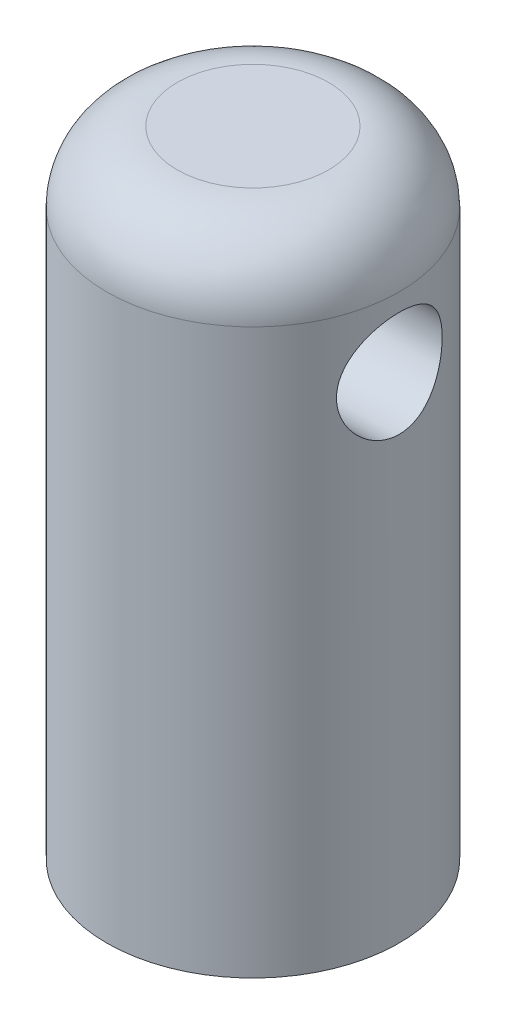
ISO-10303-21;
HEADER;
FILE_DESCRIPTION(('STEP AP214'),'2;1');
FILE_NAME('part.step','',(''),(''),'','','');
FILE_SCHEMA(('AUTOMOTIVE_DESIGN { 1 0 10303 214 1 1 1 1 }'));
ENDSEC;
DATA;
#1=APPLICATION_CONTEXT('core data for automotive mechanical design processes');
#2=APPLICATION_PROTOCOL_DEFINITION('international standard','automotive_design',2000,#1);
#3=PRODUCT_CONTEXT('',#1,'mechanical');
#4=PRODUCT('Part','Part','',(#3));
#5=PRODUCT_RELATED_PRODUCT_CATEGORY('part','',(#4));
#6=PRODUCT_DEFINITION_FORMATION('','',#4);
#7=PRODUCT_DEFINITION_CONTEXT('part definition',#1,'design');
#8=PRODUCT_DEFINITION('design','',#6,#7);
#9=PRODUCT_DEFINITION_SHAPE('','',#8);
#10=(LENGTH_UNIT() NAMED_UNIT(*) SI_UNIT(.MILLI.,.METRE.));
#11=(NAMED_UNIT(*) PLANE_ANGLE_UNIT() SI_UNIT($,.RADIAN.));
#12=(NAMED_UNIT(*) SI_UNIT($,.STERADIAN.) SOLID_ANGLE_UNIT());
#13=UNCERTAINTY_MEASURE_WITH_UNIT(LENGTH_MEASURE(1.E-05),#10,'distance_accuracy_value','');
#14=(GEOMETRIC_REPRESENTATION_CONTEXT(3) GLOBAL_UNCERTAINTY_ASSIGNED_CONTEXT((#13)) GLOBAL_UNIT_ASSIGNED_CONTEXT((#10,
#11,#12)) REPRESENTATION_CONTEXT('',''));
#15=CARTESIAN_POINT('',(0.,0.,0.));
#16=DIRECTION('',(0.,0.,1.));
#17=DIRECTION('',(1.,0.,0.));
#18=AXIS2_PLACEMENT_3D('',#15,#16,#17);
#19=CARTESIAN_POINT('',(0.,18.,0.));
#20=DIRECTION('',(0.,-1.,0.));
#21=DIRECTION('',(0.,0.,-1.));
#22=AXIS2_PLACEMENT_3D('',#19,#20,#21);
#23=CYLINDRICAL_SURFACE('',#22,4.15);
#24=CARTESIAN_POINT('',(0.,16.,0.));
#25=DIRECTION('',(0.,1.,0.));
#26=DIRECTION('',(0.,0.,1.));
#27=AXIS2_PLACEMENT_3D('',#24,#25,#26);
#28=CIRCLE('',#27,4.15);
#29=CARTESIAN_POINT('',(0.,16.,4.15));
#30=VERTEX_POINT('',#29);
#31=EDGE_CURVE('E10',#30,#30,#28,.F.);
#32=ORIENTED_EDGE('',*,*,#31,.T.);
#33=EDGE_LOOP('',(#32));
#34=FACE_BOUND('',#33,.T.);
#35=CARTESIAN_POINT('',(-4.15,12.5,0.));
#36=CARTESIAN_POINT('',(-4.15000143003029,12.4999980333435,-0.0814400855319912));
#37=CARTESIAN_POINT('',(-4.14758142156251,12.5066535382665,-0.162866271252026));
#38=CARTESIAN_POINT('',(-4.13816813003433,12.5330009360362,-0.323296632147034));
#39=CARTESIAN_POINT('',(-4.13117513878816,12.5526919970503,-0.402300961530375));
#40=CARTESIAN_POINT('',(-4.11336965741352,12.6043308814919,-0.555551373556141));
#41=CARTESIAN_POINT('',(-4.1025642129004,12.6362561048502,-0.629805936996274));
#42=CARTESIAN_POINT('',(-4.07821890340622,12.7113464147926,-0.771902880179988));
#43=CARTESIAN_POINT('',(-4.06467836386934,12.7545142749068,-0.83974367202545));
#44=CARTESIAN_POINT('',(-4.03566630697274,12.8526659904825,-0.96979273515427));
#45=CARTESIAN_POINT('',(-4.02014287032182,12.9080188449633,-1.03171083460301));
#46=CARTESIAN_POINT('',(-3.98917992273541,13.0281857192339,-1.14561514020706));
#47=CARTESIAN_POINT('',(-3.97374043604327,13.0930023356186,-1.19759861150761));
#48=CARTESIAN_POINT('',(-3.94410071947246,13.23301636052,-1.29193844006037));
#49=CARTESIAN_POINT('',(-3.92996245591669,13.3084968857948,-1.33389600496389));
#50=CARTESIAN_POINT('',(-3.90532763129971,13.4660355486232,-1.40439347036955));
#51=CARTESIAN_POINT('',(-3.89482973324999,13.5480912576648,-1.43293829830652));
#52=CARTESIAN_POINT('',(-3.87921646915367,13.7131223491049,-1.47467343668188));
#53=CARTESIAN_POINT('',(-3.87390880128095,13.7959396905442,-1.48841441150724));
#54=CARTESIAN_POINT('',(-3.86871199521892,13.962861622455,-1.50187373475926));
#55=CARTESIAN_POINT('',(-3.86882081838796,14.046965716708,-1.50159735899095));
#56=CARTESIAN_POINT('',(-3.87427796865347,14.2091558282624,-1.48745303888326));
#57=CARTESIAN_POINT('',(-3.87933796727285,14.2873185316011,-1.47433301698891));
#58=CARTESIAN_POINT('',(-3.89365064359877,14.4402472250398,-1.43610476286552));
#59=CARTESIAN_POINT('',(-3.902903907682,14.5150127384752,-1.41099485397165));
#60=CARTESIAN_POINT('',(-3.92474456516685,14.6606073478115,-1.34906302546195));
#61=CARTESIAN_POINT('',(-3.93738909491279,14.7313410988246,-1.31203799280697));
#62=CARTESIAN_POINT('',(-3.96456687961516,14.8658151955463,-1.22746821395406));
#63=CARTESIAN_POINT('',(-3.9791007522295,14.9295532416186,-1.17992002397261));
#64=CARTESIAN_POINT('',(-4.00952118448171,15.05238869163,-1.07217458625208));
#65=CARTESIAN_POINT('',(-4.02543570504372,15.1109523235679,-1.01137531117106));
#66=CARTESIAN_POINT('',(-4.05604403844514,15.2172046397643,-0.880630279258244));
#67=CARTESIAN_POINT('',(-4.07073768921005,15.2648918816078,-0.810683311202381));
#68=CARTESIAN_POINT('',(-4.09750501515251,15.3485711993468,-0.662344833747496));
#69=CARTESIAN_POINT('',(-4.10954078200126,15.3843972988541,-0.583852373734485));
#70=CARTESIAN_POINT('',(-4.12935735570145,15.4421628926842,-0.421412511592169));
#71=CARTESIAN_POINT('',(-4.13713991256227,15.4641080989717,-0.337467368933897));
#72=CARTESIAN_POINT('',(-4.14727149897669,15.4924901151261,-0.171006353890036));
#73=CARTESIAN_POINT('',(-4.14987240556979,15.4996465010243,-0.0886283682666874));
#74=CARTESIAN_POINT('',(-4.15011826285779,15.5003276814301,0.0761822484580407));
#75=CARTESIAN_POINT('',(-4.14776422104452,15.4938552470915,0.158614865044288));
#76=CARTESIAN_POINT('',(-4.13853111751534,15.4680176316146,0.318162968952119));
#77=CARTESIAN_POINT('',(-4.13181406990674,15.4491137730244,0.395363500790042));
#78=CARTESIAN_POINT('',(-4.11469233681061,15.3995469499806,0.545451085567498));
#79=CARTESIAN_POINT('',(-4.10428717191908,15.3688824567653,0.6183375763036));
#80=CARTESIAN_POINT('',(-4.08045745892182,15.2957085926606,0.760052659190625));
#81=CARTESIAN_POINT('',(-4.06695527801488,15.2528864169269,0.828706290933764));
#82=CARTESIAN_POINT('',(-4.03843865829634,15.1569706038692,0.958075492738519));
#83=CARTESIAN_POINT('',(-4.02342369172645,15.1038733759478,1.01878827541994));
#84=CARTESIAN_POINT('',(-3.99253971688616,14.9855470646003,1.13396362340661));
#85=CARTESIAN_POINT('',(-3.97666822387657,14.9198189506232,1.18791415077587));
#86=CARTESIAN_POINT('',(-3.94665847791854,14.779918094427,1.28410809378483));
#87=CARTESIAN_POINT('',(-3.93252032519495,14.705744864374,1.32635083263708));
#88=CARTESIAN_POINT('',(-3.90766943749284,14.5506688773045,1.39787832776533));
#89=CARTESIAN_POINT('',(-3.89696272656018,14.469754596343,1.42714032999966));
#90=CARTESIAN_POINT('',(-3.88045113695488,14.3036576009353,1.47145132511309));
#91=CARTESIAN_POINT('',(-3.87464351502234,14.2184773036053,1.48650827271605));
#92=CARTESIAN_POINT('',(-3.86893495059697,14.0517694834162,1.50129913045682));
#93=CARTESIAN_POINT('',(-3.86870052741929,13.970329427219,1.50189818503133));
#94=CARTESIAN_POINT('',(-3.87332008254716,13.8085752873644,1.48994353454471));
#95=CARTESIAN_POINT('',(-3.87817364559763,13.7282611123604,1.47739090285615));
#96=CARTESIAN_POINT('',(-3.89215405778937,13.5731716662505,1.44014369068852));
#97=CARTESIAN_POINT('',(-3.90116507702552,13.4983062497496,1.41577736718979));
#98=CARTESIAN_POINT('',(-3.9223854643484,13.3536767318407,1.35587501491621));
#99=CARTESIAN_POINT('',(-3.93459561175959,13.2839138787484,1.32033626405706));
#100=CARTESIAN_POINT('',(-3.96159301798298,13.1477092834115,1.23704697958592));
#101=CARTESIAN_POINT('',(-3.9764781069732,13.0816042289039,1.18877789035097));
#102=CARTESIAN_POINT('',(-4.00678846315337,12.9581546803121,1.0822251629785));
#103=CARTESIAN_POINT('',(-4.02221389453071,12.9008128778996,1.02393845951909));
#104=CARTESIAN_POINT('',(-4.05277121962981,12.7936739448662,0.895599109546909));
#105=CARTESIAN_POINT('',(-4.06785203653187,12.7443816776965,0.825111032389388));
#106=CARTESIAN_POINT('',(-4.09521579412732,12.6583743200156,0.676329473531957));
#107=CARTESIAN_POINT('',(-4.10749884732183,12.6216587237529,0.59803630586528));
#108=CARTESIAN_POINT('',(-4.12800060422919,12.5617029437689,0.434702638880409));
#109=CARTESIAN_POINT('',(-4.13616252567104,12.5386502998642,0.349585662601991));
#110=CARTESIAN_POINT('',(-4.14716034530471,12.5078030561034,0.176306177660809));
#111=CARTESIAN_POINT('',(-4.14999845223708,12.5000021285689,0.0881449474633849));
#112=CARTESIAN_POINT('',(-4.15,12.5,0.));
#113=B_SPLINE_CURVE_WITH_KNOTS('',3,(#35,#36,#37,#38,#39,#40,#41,#42,#43,#44,#45,#46,#47,#48,
#49,#50,#51,#52,#53,#54,#55,#56,#57,#58,#59,#60,#61,#62,#63,#64,#65,#66,#67,#68,#69,#70,#71,#72,
#73,#74,#75,#76,#77,#78,#79,#80,#81,#82,#83,#84,#85,#86,#87,#88,#89,#90,#91,#92,#93,#94,#95,#96,
#97,#98,#99,#100,#101,#102,#103,#104,#105,#106,#107,#108,#109,#110,#111,#112),.UNSPECIFIED.,.T.,
.F.,(4,2,2,2,2,2,2,2,2,2,2,2,2,2,2,2,2,2,2,2,2,2,2,2,2,2,2,2,2,2,2,2,2,2,2,2,2,2,4),(0.,
0.243995375605332,0.487975182733872,0.731506443788315,0.975097840393538,1.22744646617127,
1.4798644600067,1.7410821226397,2.00220374661341,2.2532359353852,2.50417364217614,
2.7413180622714,2.97849565433975,3.21995193400208,3.46148734922635,3.71801803717578,
3.97458272619208,4.23459919210401,4.49450859194187,4.74144166583083,4.98832453555947,
5.22652677827391,5.46475999533177,5.70978599880215,5.95489778127164,6.21319747375317,
6.47151209454885,6.73027774501933,6.98889840250596,7.23200244813754,7.47508665442021,
7.71177316638803,7.94851739013103,8.19701182001203,8.44558242331981,8.70628568188906,
8.96697845544593,9.23117130220569,9.4952545165534),.UNSPECIFIED.);
#114=CARTESIAN_POINT('',(-4.15,12.5,0.));
#115=VERTEX_POINT('',#114);
#116=EDGE_CURVE('E46',#115,#115,#113,.T.);
#117=ORIENTED_EDGE('',*,*,#116,.T.);
#118=EDGE_LOOP('',(#117));
#119=FACE_BOUND('',#118,.T.);
#120=CARTESIAN_POINT('',(3.86943148278917,14.,-1.5));
#121=CARTESIAN_POINT('',(3.86942965987514,13.918756639483,-1.50000204617039));
#122=CARTESIAN_POINT('',(3.8720180417576,13.8375272963331,-1.49337742480288));
#123=CARTESIAN_POINT('',(3.88202574833964,13.6775035304927,-1.46716389412437));
#124=CARTESIAN_POINT('',(3.88944521590768,13.5987091798837,-1.44757460141219));
#125=CARTESIAN_POINT('',(3.90816721246071,13.4459063125508,-1.3962327859776));
#126=CARTESIAN_POINT('',(3.91946101705452,13.3718874832494,-1.36450757310196));
#127=CARTESIAN_POINT('',(3.94464557685853,13.2301953075299,-1.28989018879869));
#128=CARTESIAN_POINT('',(3.95853704885431,13.1625237202914,-1.24699493388767));
#129=CARTESIAN_POINT('',(3.98806965416322,13.0323266106155,-1.14913649213948));
#130=CARTESIAN_POINT('',(4.00375971531451,12.9701356062644,-1.09374289340616));
#131=CARTESIAN_POINT('',(4.034711704888,12.855692649012,-0.97337520313558));
#132=CARTESIAN_POINT('',(4.04997354958261,12.8034426284474,-0.908399253321233));
#133=CARTESIAN_POINT('',(4.07892597308986,12.7087853435518,-0.768203530001209));
#134=CARTESIAN_POINT('',(4.09255243408543,12.6667372701131,-0.692726816994579));
#135=CARTESIAN_POINT('',(4.11611459871196,12.596071751933,-0.53519237998701));
#136=CARTESIAN_POINT('',(4.12605148471053,12.5674500037923,-0.453136774536789));
#137=CARTESIAN_POINT('',(4.14076783336458,12.5256096423136,-0.288287564229631));
#138=CARTESIAN_POINT('',(4.14573922834442,12.511816085864,-0.205657349029418));
#139=CARTESIAN_POINT('',(4.15065072565593,12.4981862106437,-0.0391154762948341));
#140=CARTESIAN_POINT('',(4.15059234856874,12.4983456736504,0.0447957862882938));
#141=CARTESIAN_POINT('',(4.14557567575914,12.5122723817432,0.207414311328065));
#142=CARTESIAN_POINT('',(4.14084296334113,12.5254131550252,0.286183368965906));
#143=CARTESIAN_POINT('',(4.12730099688341,12.563881681934,0.44031195387713));
#144=CARTESIAN_POINT('',(4.11849145706477,12.5892102899129,0.515671241724632));
#145=CARTESIAN_POINT('',(4.09752014235388,12.6516509521593,0.662104045788295));
#146=CARTESIAN_POINT('',(4.08531266164164,12.6889247976671,0.733101756138568));
#147=CARTESIAN_POINT('',(4.05879286142779,12.7740582987958,0.868005746156516));
#148=CARTESIAN_POINT('',(4.04447989153247,12.8219212277359,0.931909823832645));
#149=CARTESIAN_POINT('',(4.01431151466932,12.9299404005725,1.05451728897978));
#150=CARTESIAN_POINT('',(3.99841456246193,12.9906259903583,1.11274479884602));
#151=CARTESIAN_POINT('',(3.96750760479459,13.1210107045607,1.21836738821606));
#152=CARTESIAN_POINT('',(3.95249779118925,13.1907117683679,1.26576013087801));
#153=CARTESIAN_POINT('',(3.92481391025065,13.3389001371238,1.34918945809022));
#154=CARTESIAN_POINT('',(3.91219060898156,13.4175312524482,1.38498878508573));
#155=CARTESIAN_POINT('',(3.89129452581236,13.5802810201912,1.44266391069934));
#156=CARTESIAN_POINT('',(3.88301952887341,13.6643968540821,1.46454679958814));
#157=CARTESIAN_POINT('',(3.87227220184197,13.8310543091467,1.49272401073424));
#158=CARTESIAN_POINT('',(3.86952098665052,13.9134510331047,1.49976847955059));
#159=CARTESIAN_POINT('',(3.86934639938099,14.0782772678379,1.50022011718802));
#160=CARTESIAN_POINT('',(3.8719218271962,14.1607067670455,1.49363035783656));
#161=CARTESIAN_POINT('',(3.88182878028342,14.3195632532701,1.46767892086844));
#162=CARTESIAN_POINT('',(3.88895177716225,14.3960960971024,1.44887662174212));
#163=CARTESIAN_POINT('',(3.90690994887044,14.544892769429,1.39972653669555));
#164=CARTESIAN_POINT('',(3.91774585100781,14.6171557582624,1.36937648859854));
#165=CARTESIAN_POINT('',(3.94238557334163,14.7582250764582,1.29676967748183));
#166=CARTESIAN_POINT('',(3.95628148710211,14.8268161042813,1.25412675132682));
#167=CARTESIAN_POINT('',(3.98531294266546,14.956137089807,1.15856425883873));
#168=CARTESIAN_POINT('',(4.00044890854598,15.0168643397494,1.10564116830254));
#169=CARTESIAN_POINT('',(4.03131865587011,15.1323914819451,0.987376007772962));
#170=CARTESIAN_POINT('',(4.04703604350514,15.1866416255732,0.921490860515432));
#171=CARTESIAN_POINT('',(4.07644627550283,15.2833715296547,0.781164422593056));
#172=CARTESIAN_POINT('',(4.09013914496421,15.325851436034,0.706723238021001));
#173=CARTESIAN_POINT('',(4.11392623755102,15.3975083987312,0.551573789215126));
#174=CARTESIAN_POINT('',(4.12403731929383,15.42674796031,0.470897122012956));
#175=CARTESIAN_POINT('',(4.1395864929142,15.4710923567192,0.305325464244328));
#176=CARTESIAN_POINT('',(4.14502660617892,15.4862033060358,0.220432315225943));
#177=CARTESIAN_POINT('',(4.15044227784074,15.5012378160601,0.0538252283509398));
#178=CARTESIAN_POINT('',(4.15069974021066,15.5019448849707,-0.0278095178903243));
#179=CARTESIAN_POINT('',(4.14644234311778,15.4901391296859,-0.189982239519512));
#180=CARTESIAN_POINT('',(4.14192799201143,15.4776277136977,-0.270520330811834));
#181=CARTESIAN_POINT('',(4.12875502298679,15.4402821304314,-0.426476778783461));
#182=CARTESIAN_POINT('',(4.12018697280803,15.4157168455167,-0.501967742306186));
#183=CARTESIAN_POINT('',(4.09979478577945,15.3552216435094,-0.647771311269437));
#184=CARTESIAN_POINT('',(4.08797003661739,15.3192895890907,-0.718082939756946));
#185=CARTESIAN_POINT('',(4.06166294940567,15.2354158913278,-0.854650380626584));
#186=CARTESIAN_POINT('',(4.04709227838616,15.1870462823186,-0.920626051702564));
#187=CARTESIAN_POINT('',(4.01709660379255,15.0803624424897,-1.04377148382961));
#188=CARTESIAN_POINT('',(4.00167130616988,15.0220447743456,-1.10093818810491));
#189=CARTESIAN_POINT('',(3.97080404711533,14.8937764904472,-1.20766398088416));
#190=CARTESIAN_POINT('',(3.95539701694856,14.8234010709974,-1.25672448263168));
#191=CARTESIAN_POINT('',(3.92717581779821,14.6749161503227,-1.34232255511236));
#192=CARTESIAN_POINT('',(3.91436157514325,14.5968068689414,-1.37886048168202));
#193=CARTESIAN_POINT('',(3.89282970703934,14.4338416984727,-1.4385434189824));
#194=CARTESIAN_POINT('',(3.88416965938765,14.3489090302654,-1.4615011667654));
#195=CARTESIAN_POINT('',(3.87247304247593,14.1759776482319,-1.49222427480715));
#196=CARTESIAN_POINT('',(3.86943345687145,14.0879806048207,-1.49999778414744));
#197=CARTESIAN_POINT('',(3.86943148278917,14.,-1.5));
#198=B_SPLINE_CURVE_WITH_KNOTS('',3,(#120,#121,#122,#123,#124,#125,#126,#127,#128,#129,#130,
#131,#132,#133,#134,#135,#136,#137,#138,#139,#140,#141,#142,#143,#144,#145,#146,#147,#148,#149,
#150,#151,#152,#153,#154,#155,#156,#157,#158,#159,#160,#161,#162,#163,#164,#165,#166,#167,#168,
#169,#170,#171,#172,#173,#174,#175,#176,#177,#178,#179,#180,#181,#182,#183,#184,#185,#186,#187,
#188,#189,#190,#191,#192,#193,#194,#195,#196,#197),.UNSPECIFIED.,.T.,.F.,(4,2,2,2,2,2,2,2,2,2,2,
2,2,2,2,2,2,2,2,2,2,2,2,2,2,2,2,2,2,2,2,2,2,2,2,2,2,2,4),(0.,0.24340306781517,0.486813334053782,
0.729679038415541,0.972611856911654,1.22572565028795,1.47888859398037,1.7399740667023,
2.00097579915924,2.25144558676209,2.50183965357817,2.74071235083241,2.97960179520871,
3.22187426315946,3.46422172777814,3.71982943679342,3.97549222336124,4.2360976456649,
4.49657018580198,4.74352334207576,4.99042086521279,5.22673878899143,5.46310303074854,
5.70789999770293,5.95278103351322,6.21189677881468,6.47100931149018,6.72888553168956,
6.98665009821674,7.23035357253213,7.47403108695803,7.71250440650457,7.95102259354818,
8.19921426656625,8.44749187089459,8.70771918456738,8.96793910311139,9.23166836289216,
9.49525604544623),.UNSPECIFIED.);
#199=CARTESIAN_POINT('',(3.86943148278917,14.,-1.5));
#200=VERTEX_POINT('',#199);
#201=EDGE_CURVE('E50',#200,#200,#198,.T.);
#202=ORIENTED_EDGE('',*,*,#201,.T.);
#203=EDGE_LOOP('',(#202));
#204=FACE_BOUND('',#203,.T.);
#205=CARTESIAN_POINT('',(0.,0.,0.));
#206=DIRECTION('',(0.,1.,0.));
#207=DIRECTION('',(0.,0.,1.));
#208=AXIS2_PLACEMENT_3D('',#205,#206,#207);
#209=CIRCLE('',#208,4.15);
#210=CARTESIAN_POINT('',(0.,0.,4.15));
#211=VERTEX_POINT('',#210);
#212=EDGE_CURVE('E97',#211,#211,#209,.T.);
#213=ORIENTED_EDGE('',*,*,#212,.T.);
#214=EDGE_LOOP('',(#213));
#215=FACE_BOUND('',#214,.T.);
#216=ADVANCED_FACE('F35',(#34,#119,#204,#215),#23,.T.);
#217=CARTESIAN_POINT('',(0.,18.,0.));
#218=DIRECTION('',(0.,1.,0.));
#219=DIRECTION('',(0.,0.,1.));
#220=AXIS2_PLACEMENT_3D('',#217,#218,#219);
#221=PLANE('',#220);
#222=CARTESIAN_POINT('',(0.,18.,0.));
#223=DIRECTION('',(0.,1.,0.));
#224=DIRECTION('',(0.,0.,1.));
#225=AXIS2_PLACEMENT_3D('',#222,#223,#224);
#226=CIRCLE('',#225,2.15);
#227=CARTESIAN_POINT('',(0.,18.,2.15));
#228=VERTEX_POINT('',#227);
#229=EDGE_CURVE('E42',#228,#228,#226,.T.);
#230=ORIENTED_EDGE('',*,*,#229,.T.);
#231=EDGE_LOOP('',(#230));
#232=FACE_BOUND('',#231,.T.);
#233=ADVANCED_FACE('F78',(#232),#221,.T.);
#234=CARTESIAN_POINT('',(0.,0.,0.));
#235=DIRECTION('',(0.,1.,0.));
#236=DIRECTION('',(0.,0.,1.));
#237=AXIS2_PLACEMENT_3D('',#234,#235,#236);
#238=PLANE('',#237);
#239=CARTESIAN_POINT('',(0.,0.,0.));
#240=DIRECTION('',(0.,-1.,0.));
#241=DIRECTION('',(0.,0.,-1.));
#242=AXIS2_PLACEMENT_3D('',#239,#240,#241);
#243=CIRCLE('',#242,1.75);
#244=CARTESIAN_POINT('',(0.,0.,-1.75));
#245=VERTEX_POINT('',#244);
#246=EDGE_CURVE('E100',#245,#245,#243,.T.);
#247=ORIENTED_EDGE('',*,*,#246,.F.);
#248=EDGE_LOOP('',(#247));
#249=FACE_BOUND('',#248,.T.);
#250=ORIENTED_EDGE('',*,*,#212,.F.);
#251=EDGE_LOOP('',(#250));
#252=FACE_BOUND('',#251,.T.);
#253=ADVANCED_FACE('F76',(#249,#252),#238,.F.);
#254=CARTESIAN_POINT('',(0.,10.,0.));
#255=DIRECTION('',(0.,-1.,0.));
#256=DIRECTION('',(0.,0.,-1.));
#257=AXIS2_PLACEMENT_3D('',#254,#255,#256);
#258=CYLINDRICAL_SURFACE('',#257,1.75);
#259=CARTESIAN_POINT('',(0.,10.,0.));
#260=DIRECTION('',(0.,-1.,0.));
#261=DIRECTION('',(0.,0.,-1.));
#262=AXIS2_PLACEMENT_3D('',#259,#260,#261);
#263=CIRCLE('',#262,1.75);
#264=CARTESIAN_POINT('',(0.,10.,-1.75));
#265=VERTEX_POINT('',#264);
#266=EDGE_CURVE('E98',#265,#265,#263,.T.);
#267=ORIENTED_EDGE('',*,*,#266,.F.);
#268=EDGE_LOOP('',(#267));
#269=FACE_BOUND('',#268,.T.);
#270=ORIENTED_EDGE('',*,*,#246,.T.);
#271=EDGE_LOOP('',(#270));
#272=FACE_BOUND('',#271,.T.);
#273=ADVANCED_FACE('F72',(#269,#272),#258,.F.);
#274=CARTESIAN_POINT('',(0.,10.,0.));
#275=DIRECTION('',(0.,-1.,0.));
#276=DIRECTION('',(0.,0.,-1.));
#277=AXIS2_PLACEMENT_3D('',#274,#275,#276);
#278=PLANE('',#277);
#279=ORIENTED_EDGE('',*,*,#266,.T.);
#280=EDGE_LOOP('',(#279));
#281=FACE_BOUND('',#280,.T.);
#282=ADVANCED_FACE('F67',(#281),#278,.T.);
#283=CARTESIAN_POINT('',(-4.15,14.,0.));
#284=DIRECTION('',(1.,0.,0.));
#285=DIRECTION('',(0.,0.,-1.));
#286=AXIS2_PLACEMENT_3D('',#283,#284,#285);
#287=CYLINDRICAL_SURFACE('',#286,1.5);
#288=ORIENTED_EDGE('',*,*,#201,.F.);
#289=EDGE_LOOP('',(#288));
#290=FACE_BOUND('',#289,.T.);
#291=ORIENTED_EDGE('',*,*,#116,.F.);
#292=EDGE_LOOP('',(#291));
#293=FACE_BOUND('',#292,.T.);
#294=ADVANCED_FACE('F63',(#290,#293),#287,.F.);
#295=CARTESIAN_POINT('',(0.,16.,0.));
#296=DIRECTION('',(0.,1.,0.));
#297=DIRECTION('',(0.,0.,1.));
#298=AXIS2_PLACEMENT_3D('',#295,#296,#297);
#299=TOROIDAL_SURFACE('',#298,2.15,2.);
#300=ORIENTED_EDGE('',*,*,#31,.F.);
#301=EDGE_LOOP('',(#300));
#302=FACE_BOUND('',#301,.T.);
#303=ORIENTED_EDGE('',*,*,#229,.F.);
#304=EDGE_LOOP('',(#303));
#305=FACE_BOUND('',#304,.T.);
#306=ADVANCED_FACE('F37',(#302,#305),#299,.T.);
#307=CLOSED_SHELL('',(#216,#233,#253,#273,#282,#294,#306));
#308=MANIFOLD_SOLID_BREP('B2',#307);
#309=ADVANCED_BREP_SHAPE_REPRESENTATION('',(#18,#308),#14);
#310=SHAPE_DEFINITION_REPRESENTATION(#9,#309);
ENDSEC;
END-ISO-10303-21;
